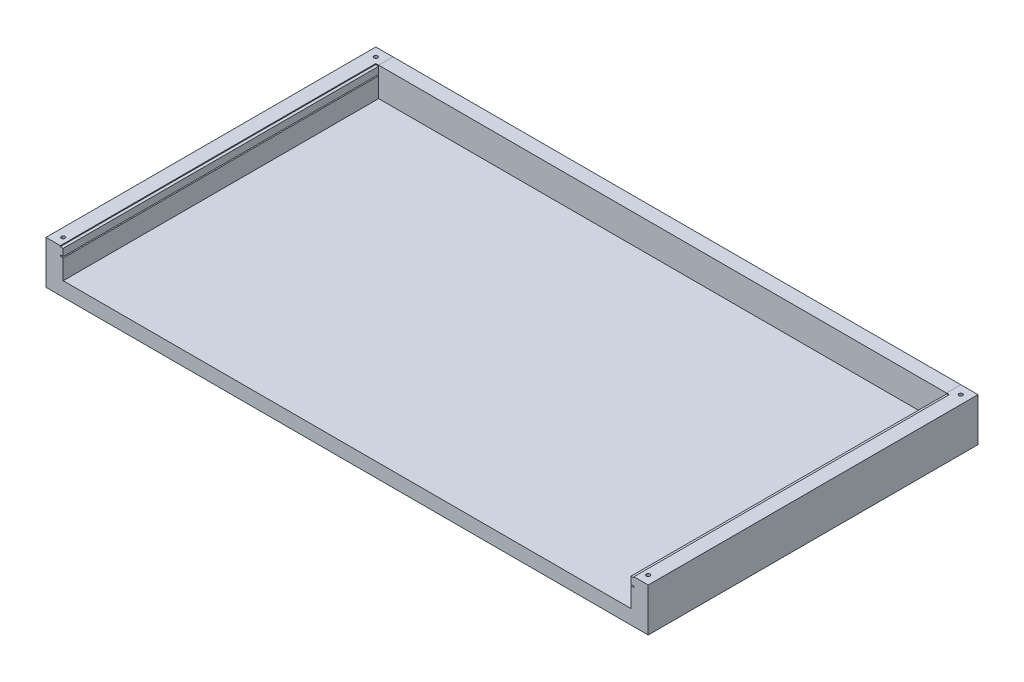
ISO-10303-21;
HEADER;
FILE_DESCRIPTION(('STEP AP214'),'2;1');
FILE_NAME('part.step','',(''),(''),'','','');
FILE_SCHEMA(('AUTOMOTIVE_DESIGN { 1 0 10303 214 1 1 1 1 }'));
ENDSEC;
DATA;
#1=APPLICATION_CONTEXT('core data for automotive mechanical design processes');
#2=APPLICATION_PROTOCOL_DEFINITION('international standard','automotive_design',2000,#1);
#3=PRODUCT_CONTEXT('',#1,'mechanical');
#4=PRODUCT('Part','Part','',(#3));
#5=PRODUCT_RELATED_PRODUCT_CATEGORY('part','',(#4));
#6=PRODUCT_DEFINITION_FORMATION('','',#4);
#7=PRODUCT_DEFINITION_CONTEXT('part definition',#1,'design');
#8=PRODUCT_DEFINITION('design','',#6,#7);
#9=PRODUCT_DEFINITION_SHAPE('','',#8);
#10=(LENGTH_UNIT() NAMED_UNIT(*) SI_UNIT(.MILLI.,.METRE.));
#11=(NAMED_UNIT(*) PLANE_ANGLE_UNIT() SI_UNIT($,.RADIAN.));
#12=(NAMED_UNIT(*) SI_UNIT($,.STERADIAN.) SOLID_ANGLE_UNIT());
#13=UNCERTAINTY_MEASURE_WITH_UNIT(LENGTH_MEASURE(1.E-05),#10,'distance_accuracy_value','');
#14=(GEOMETRIC_REPRESENTATION_CONTEXT(3) GLOBAL_UNCERTAINTY_ASSIGNED_CONTEXT((#13)) GLOBAL_UNIT_ASSIGNED_CONTEXT((#10,
#11,#12)) REPRESENTATION_CONTEXT('',''));
#15=CARTESIAN_POINT('',(0.,0.,0.));
#16=DIRECTION('',(0.,0.,1.));
#17=DIRECTION('',(1.,0.,0.));
#18=AXIS2_PLACEMENT_3D('',#15,#16,#17);
#19=CARTESIAN_POINT('',(0.,0.,0.));
#20=DIRECTION('',(0.,1.,0.));
#21=DIRECTION('',(0.,0.,1.));
#22=AXIS2_PLACEMENT_3D('',#19,#20,#21);
#23=PLANE('',#22);
#24=DIRECTION('',(-1.,0.,0.));
#25=VECTOR('',#24,1.);
#26=CARTESIAN_POINT('',(990.,0.,0.));
#27=LINE('',#26,#25);
#28=CARTESIAN_POINT('',(990.,0.,0.));
#29=VERTEX_POINT('',#28);
#30=CARTESIAN_POINT('',(-990.,0.,0.));
#31=VERTEX_POINT('',#30);
#32=EDGE_CURVE('E98',#29,#31,#27,.T.);
#33=ORIENTED_EDGE('',*,*,#32,.F.);
#34=DIRECTION('',(0.,0.,-1.));
#35=VECTOR('',#34,1.);
#36=CARTESIAN_POINT('',(990.,0.,50.0000000000005));
#37=LINE('',#36,#35);
#38=CARTESIAN_POINT('',(990.,0.,50.0000000000005));
#39=VERTEX_POINT('',#38);
#40=EDGE_CURVE('E109',#39,#29,#37,.T.);
#41=ORIENTED_EDGE('',*,*,#40,.F.);
#42=DIRECTION('',(1.,0.,0.));
#43=VECTOR('',#42,1.);
#44=CARTESIAN_POINT('',(-990.,0.,50.0000000000005));
#45=LINE('',#44,#43);
#46=CARTESIAN_POINT('',(-990.,0.,50.0000000000005));
#47=VERTEX_POINT('',#46);
#48=EDGE_CURVE('E100',#47,#39,#45,.T.);
#49=ORIENTED_EDGE('',*,*,#48,.F.);
#50=DIRECTION('',(0.,0.,1.));
#51=VECTOR('',#50,1.);
#52=CARTESIAN_POINT('',(-990.,0.,0.));
#53=LINE('',#52,#51);
#54=EDGE_CURVE('E90',#31,#47,#53,.T.);
#55=ORIENTED_EDGE('',*,*,#54,.F.);
#56=EDGE_LOOP('',(#33,#41,#49,#55));
#57=FACE_BOUND('',#56,.T.);
#58=ADVANCED_FACE('F48',(#57),#23,.F.);
#59=CARTESIAN_POINT('',(990.,2131.68121251787,50.0000000000005));
#60=DIRECTION('',(-1.,0.,0.));
#61=DIRECTION('',(0.,0.,1.));
#62=AXIS2_PLACEMENT_3D('',#59,#60,#61);
#63=PLANE('',#62);
#64=DIRECTION('',(0.,-1.,0.));
#65=VECTOR('',#64,1.);
#66=CARTESIAN_POINT('',(990.,2131.68121251787,0.));
#67=LINE('',#66,#65);
#68=CARTESIAN_POINT('',(990.,151.05,0.));
#69=VERTEX_POINT('',#68);
#70=EDGE_CURVE('E103',#69,#29,#67,.T.);
#71=ORIENTED_EDGE('',*,*,#70,.F.);
#72=DIRECTION('',(0.,0.,1.));
#73=VECTOR('',#72,1.);
#74=CARTESIAN_POINT('',(990.,151.05,50.0000000000005));
#75=LINE('',#74,#73);
#76=CARTESIAN_POINT('',(990.,151.05,50.0000000000005));
#77=VERTEX_POINT('',#76);
#78=EDGE_CURVE('E52',#69,#77,#75,.T.);
#79=ORIENTED_EDGE('',*,*,#78,.T.);
#80=DIRECTION('',(0.,-1.,0.));
#81=VECTOR('',#80,1.);
#82=CARTESIAN_POINT('',(990.,2131.68121251787,50.0000000000005));
#83=LINE('',#82,#81);
#84=EDGE_CURVE('E112',#77,#39,#83,.T.);
#85=ORIENTED_EDGE('',*,*,#84,.T.);
#86=ORIENTED_EDGE('',*,*,#40,.T.);
#87=EDGE_LOOP('',(#71,#79,#85,#86));
#88=FACE_BOUND('',#87,.T.);
#89=ADVANCED_FACE('F121',(#88),#63,.F.);
#90=CARTESIAN_POINT('',(-990.,2131.68121251787,50.0000000000005));
#91=DIRECTION('',(0.,0.,-1.));
#92=DIRECTION('',(-1.,0.,0.));
#93=AXIS2_PLACEMENT_3D('',#90,#91,#92);
#94=PLANE('',#93);
#95=ORIENTED_EDGE('',*,*,#84,.F.);
#96=DIRECTION('',(-1.,0.,0.));
#97=VECTOR('',#96,1.);
#98=CARTESIAN_POINT('',(-990.,151.05,50.0000000000005));
#99=LINE('',#98,#97);
#100=CARTESIAN_POINT('',(-990.,151.05,50.0000000000005));
#101=VERTEX_POINT('',#100);
#102=EDGE_CURVE('E118',#77,#101,#99,.T.);
#103=ORIENTED_EDGE('',*,*,#102,.T.);
#104=DIRECTION('',(0.,-1.,0.));
#105=VECTOR('',#104,1.);
#106=CARTESIAN_POINT('',(-990.,2131.68121251787,50.0000000000005));
#107=LINE('',#106,#105);
#108=EDGE_CURVE('E94',#101,#47,#107,.T.);
#109=ORIENTED_EDGE('',*,*,#108,.T.);
#110=ORIENTED_EDGE('',*,*,#48,.T.);
#111=EDGE_LOOP('',(#95,#103,#109,#110));
#112=FACE_BOUND('',#111,.T.);
#113=ADVANCED_FACE('F117',(#112),#94,.F.);
#114=CARTESIAN_POINT('',(-990.,2131.68121251787,0.));
#115=DIRECTION('',(1.,0.,0.));
#116=DIRECTION('',(0.,0.,-1.));
#117=AXIS2_PLACEMENT_3D('',#114,#115,#116);
#118=PLANE('',#117);
#119=ORIENTED_EDGE('',*,*,#108,.F.);
#120=DIRECTION('',(0.,0.,-1.));
#121=VECTOR('',#120,1.);
#122=CARTESIAN_POINT('',(-990.,151.05,0.));
#123=LINE('',#122,#121);
#124=CARTESIAN_POINT('',(-990.,151.05,0.));
#125=VERTEX_POINT('',#124);
#126=EDGE_CURVE('E57',#101,#125,#123,.T.);
#127=ORIENTED_EDGE('',*,*,#126,.T.);
#128=DIRECTION('',(0.,-1.,0.));
#129=VECTOR('',#128,1.);
#130=CARTESIAN_POINT('',(-990.,2131.68121251787,0.));
#131=LINE('',#130,#129);
#132=EDGE_CURVE('E87',#125,#31,#131,.T.);
#133=ORIENTED_EDGE('',*,*,#132,.T.);
#134=ORIENTED_EDGE('',*,*,#54,.T.);
#135=EDGE_LOOP('',(#119,#127,#133,#134));
#136=FACE_BOUND('',#135,.T.);
#137=ADVANCED_FACE('F89',(#136),#118,.F.);
#138=CARTESIAN_POINT('',(990.,2131.68121251787,0.));
#139=DIRECTION('',(0.,0.,1.));
#140=DIRECTION('',(1.,0.,0.));
#141=AXIS2_PLACEMENT_3D('',#138,#139,#140);
#142=PLANE('',#141);
#143=ORIENTED_EDGE('',*,*,#132,.F.);
#144=DIRECTION('',(1.,0.,0.));
#145=VECTOR('',#144,1.);
#146=CARTESIAN_POINT('',(990.,151.05,0.));
#147=LINE('',#146,#145);
#148=EDGE_CURVE('E12',#125,#69,#147,.T.);
#149=ORIENTED_EDGE('',*,*,#148,.T.);
#150=ORIENTED_EDGE('',*,*,#70,.T.);
#151=ORIENTED_EDGE('',*,*,#32,.T.);
#152=EDGE_LOOP('',(#143,#149,#150,#151));
#153=FACE_BOUND('',#152,.T.);
#154=ADVANCED_FACE('F50',(#153),#142,.F.);
#155=CARTESIAN_POINT('',(-1050.,151.05,1150.));
#156=DIRECTION('',(0.,-1.,0.));
#157=DIRECTION('',(0.,0.,-1.));
#158=AXIS2_PLACEMENT_3D('',#155,#156,#157);
#159=PLANE('',#158);
#160=ORIENTED_EDGE('',*,*,#126,.F.);
#161=ORIENTED_EDGE('',*,*,#102,.F.);
#162=ORIENTED_EDGE('',*,*,#78,.F.);
#163=ORIENTED_EDGE('',*,*,#148,.F.);
#164=EDGE_LOOP('',(#160,#161,#162,#163));
#165=FACE_BOUND('',#164,.T.);
#166=ADVANCED_FACE('F135',(#165),#159,.F.);
#167=CLOSED_SHELL('',(#58,#89,#113,#137,#154,#166));
#168=MANIFOLD_SOLID_BREP('B2',#167);
#169=CARTESIAN_POINT('',(1050.,151.05,1150.));
#170=DIRECTION('',(0.,-1.,0.));
#171=DIRECTION('',(0.,0.,-1.));
#172=AXIS2_PLACEMENT_3D('',#169,#170,#171);
#173=PLANE('',#172);
#174=CARTESIAN_POINT('',(1020.,151.05,1120.));
#175=DIRECTION('',(0.,-1.,0.));
#176=DIRECTION('',(0.,0.,-1.));
#177=AXIS2_PLACEMENT_3D('',#174,#175,#176);
#178=CIRCLE('',#177,6.35000000000015);
#179=CARTESIAN_POINT('',(1020.,151.05,1113.65));
#180=VERTEX_POINT('',#179);
#181=EDGE_CURVE('E572',#180,#180,#178,.T.);
#182=ORIENTED_EDGE('',*,*,#181,.T.);
#183=EDGE_LOOP('',(#182));
#184=FACE_BOUND('',#183,.T.);
#185=CARTESIAN_POINT('',(1020.,151.05,30.));
#186=DIRECTION('',(0.,-1.,0.));
#187=DIRECTION('',(0.,0.,-1.));
#188=AXIS2_PLACEMENT_3D('',#185,#186,#187);
#189=CIRCLE('',#188,6.35000000000016);
#190=CARTESIAN_POINT('',(1020.,151.05,23.6499999999999));
#191=VERTEX_POINT('',#190);
#192=EDGE_CURVE('E564',#191,#191,#189,.T.);
#193=ORIENTED_EDGE('',*,*,#192,.T.);
#194=EDGE_LOOP('',(#193));
#195=FACE_BOUND('',#194,.T.);
#196=DIRECTION('',(0.,0.,1.));
#197=VECTOR('',#196,1.);
#198=CARTESIAN_POINT('',(1000.,151.05,-1950.00440999514));
#199=LINE('',#198,#197);
#200=CARTESIAN_POINT('',(1000.,151.05,50.0000000000007));
#201=VERTEX_POINT('',#200);
#202=CARTESIAN_POINT('',(1000.,151.05,1150.));
#203=VERTEX_POINT('',#202);
#204=EDGE_CURVE('E321',#201,#203,#199,.T.);
#205=ORIENTED_EDGE('',*,*,#204,.T.);
#206=DIRECTION('',(-1.,0.,0.));
#207=VECTOR('',#206,1.);
#208=CARTESIAN_POINT('',(1050.,151.05,1150.));
#209=LINE('',#208,#207);
#210=CARTESIAN_POINT('',(1050.,151.05,1150.));
#211=VERTEX_POINT('',#210);
#212=EDGE_CURVE('E448',#211,#203,#209,.T.);
#213=ORIENTED_EDGE('',*,*,#212,.F.);
#214=DIRECTION('',(0.,0.,-1.));
#215=VECTOR('',#214,1.);
#216=CARTESIAN_POINT('',(1050.,151.05,1150.));
#217=LINE('',#216,#215);
#218=CARTESIAN_POINT('',(1050.,151.05,0.));
#219=VERTEX_POINT('',#218);
#220=EDGE_CURVE('E522',#211,#219,#217,.T.);
#221=ORIENTED_EDGE('',*,*,#220,.T.);
#222=DIRECTION('',(-1.,0.,0.));
#223=VECTOR('',#222,1.);
#224=CARTESIAN_POINT('',(1050.,151.05,0.));
#225=LINE('',#224,#223);
#226=CARTESIAN_POINT('',(990.,151.05,0.));
#227=VERTEX_POINT('',#226);
#228=EDGE_CURVE('E477',#219,#227,#225,.T.);
#229=ORIENTED_EDGE('',*,*,#228,.T.);
#230=DIRECTION('',(0.,0.,-1.));
#231=VECTOR('',#230,1.);
#232=CARTESIAN_POINT('',(990.,151.05,1150.));
#233=LINE('',#232,#231);
#234=CARTESIAN_POINT('',(990.,151.05,50.0000000000007));
#235=VERTEX_POINT('',#234);
#236=EDGE_CURVE('E345',#235,#227,#233,.T.);
#237=ORIENTED_EDGE('',*,*,#236,.F.);
#238=DIRECTION('',(1.,0.,0.));
#239=VECTOR('',#238,1.);
#240=CARTESIAN_POINT('',(0.,151.05,50.0000000000007));
#241=LINE('',#240,#239);
#242=EDGE_CURVE('E336',#235,#201,#241,.T.);
#243=ORIENTED_EDGE('',*,*,#242,.T.);
#244=EDGE_LOOP('',(#205,#213,#221,#229,#237,#243));
#245=FACE_BOUND('',#244,.T.);
#246=ADVANCED_FACE('F171',(#184,#195,#245),#173,.F.);
#247=CARTESIAN_POINT('',(990.,151.05,1150.));
#248=DIRECTION('',(1.,0.,0.));
#249=DIRECTION('',(0.,0.,-1.));
#250=AXIS2_PLACEMENT_3D('',#247,#248,#249);
#251=PLANE('',#250);
#252=DIRECTION('',(0.,0.,1.));
#253=VECTOR('',#252,1.);
#254=CARTESIAN_POINT('',(990.,147.85,1150.));
#255=LINE('',#254,#253);
#256=CARTESIAN_POINT('',(990.,147.85,50.0000000000007));
#257=VERTEX_POINT('',#256);
#258=CARTESIAN_POINT('',(990.,147.85,1150.));
#259=VERTEX_POINT('',#258);
#260=EDGE_CURVE('E429',#257,#259,#255,.T.);
#261=ORIENTED_EDGE('',*,*,#260,.F.);
#262=DIRECTION('',(0.,1.,0.));
#263=VECTOR('',#262,1.);
#264=CARTESIAN_POINT('',(990.,151.05,50.0000000000005));
#265=LINE('',#264,#263);
#266=EDGE_CURVE('E436',#257,#235,#265,.T.);
#267=ORIENTED_EDGE('',*,*,#266,.T.);
#268=ORIENTED_EDGE('',*,*,#236,.T.);
#269=DIRECTION('',(0.,-1.,0.));
#270=VECTOR('',#269,1.);
#271=CARTESIAN_POINT('',(990.,151.05,0.));
#272=LINE('',#271,#270);
#273=CARTESIAN_POINT('',(990.,50.,0.));
#274=VERTEX_POINT('',#273);
#275=EDGE_CURVE('E480',#227,#274,#272,.T.);
#276=ORIENTED_EDGE('',*,*,#275,.T.);
#277=DIRECTION('',(0.,0.,-1.));
#278=VECTOR('',#277,1.);
#279=CARTESIAN_POINT('',(990.,50.,1150.));
#280=LINE('',#279,#278);
#281=CARTESIAN_POINT('',(990.,50.,1150.));
#282=VERTEX_POINT('',#281);
#283=EDGE_CURVE('E516',#282,#274,#280,.T.);
#284=ORIENTED_EDGE('',*,*,#283,.F.);
#285=DIRECTION('',(0.,-1.,0.));
#286=VECTOR('',#285,1.);
#287=CARTESIAN_POINT('',(990.,151.05,1150.));
#288=LINE('',#287,#286);
#289=CARTESIAN_POINT('',(990.,118.85,1150.));
#290=VERTEX_POINT('',#289);
#291=EDGE_CURVE('E452',#290,#282,#288,.T.);
#292=ORIENTED_EDGE('',*,*,#291,.F.);
#293=DIRECTION('',(0.,0.,1.));
#294=VECTOR('',#293,1.);
#295=CARTESIAN_POINT('',(990.,118.85,1150.));
#296=LINE('',#295,#294);
#297=CARTESIAN_POINT('',(990.,118.85,50.0000000000007));
#298=VERTEX_POINT('',#297);
#299=EDGE_CURVE('E423',#298,#290,#296,.T.);
#300=ORIENTED_EDGE('',*,*,#299,.F.);
#301=DIRECTION('',(0.,1.,0.));
#302=VECTOR('',#301,1.);
#303=CARTESIAN_POINT('',(990.,151.05,50.0000000000005));
#304=LINE('',#303,#302);
#305=CARTESIAN_POINT('',(990.,123.05,50.0000000000007));
#306=VERTEX_POINT('',#305);
#307=EDGE_CURVE('E439',#298,#306,#304,.T.);
#308=ORIENTED_EDGE('',*,*,#307,.T.);
#309=DIRECTION('',(0.,0.,-1.));
#310=VECTOR('',#309,1.);
#311=CARTESIAN_POINT('',(990.,123.05,1150.));
#312=LINE('',#311,#310);
#313=CARTESIAN_POINT('',(990.,123.05,1150.));
#314=VERTEX_POINT('',#313);
#315=EDGE_CURVE('E417',#314,#306,#312,.T.);
#316=ORIENTED_EDGE('',*,*,#315,.F.);
#317=EDGE_CURVE('E455',#259,#314,#288,.T.);
#318=ORIENTED_EDGE('',*,*,#317,.F.);
#319=EDGE_LOOP('',(#261,#267,#268,#276,#284,#292,#300,#308,#316,#318));
#320=FACE_BOUND('',#319,.T.);
#321=ADVANCED_FACE('F634',(#320),#251,.F.);
#322=CARTESIAN_POINT('',(-990.,151.05,1150.));
#323=DIRECTION('',(-1.,0.,0.));
#324=DIRECTION('',(0.,0.,1.));
#325=AXIS2_PLACEMENT_3D('',#322,#323,#324);
#326=PLANE('',#325);
#327=DIRECTION('',(0.,0.,-1.));
#328=VECTOR('',#327,1.);
#329=CARTESIAN_POINT('',(-990.,147.85,1150.));
#330=LINE('',#329,#328);
#331=CARTESIAN_POINT('',(-990.,147.85,1150.));
#332=VERTEX_POINT('',#331);
#333=CARTESIAN_POINT('',(-990.,147.85,50.0000000000007));
#334=VERTEX_POINT('',#333);
#335=EDGE_CURVE('E426',#332,#334,#330,.T.);
#336=ORIENTED_EDGE('',*,*,#335,.F.);
#337=DIRECTION('',(0.,1.,0.));
#338=VECTOR('',#337,1.);
#339=CARTESIAN_POINT('',(-990.,151.05,1150.));
#340=LINE('',#339,#338);
#341=CARTESIAN_POINT('',(-990.,123.05,1150.));
#342=VERTEX_POINT('',#341);
#343=EDGE_CURVE('E459',#342,#332,#340,.T.);
#344=ORIENTED_EDGE('',*,*,#343,.F.);
#345=DIRECTION('',(0.,0.,1.));
#346=VECTOR('',#345,1.);
#347=CARTESIAN_POINT('',(-990.,123.05,1150.));
#348=LINE('',#347,#346);
#349=CARTESIAN_POINT('',(-990.,123.05,50.0000000000007));
#350=VERTEX_POINT('',#349);
#351=EDGE_CURVE('E353',#350,#342,#348,.T.);
#352=ORIENTED_EDGE('',*,*,#351,.F.);
#353=DIRECTION('',(0.,-1.,0.));
#354=VECTOR('',#353,1.);
#355=CARTESIAN_POINT('',(-990.,151.05,50.0000000000005));
#356=LINE('',#355,#354);
#357=CARTESIAN_POINT('',(-990.,118.849999999999,50.0000000000007));
#358=VERTEX_POINT('',#357);
#359=EDGE_CURVE('E46',#350,#358,#356,.T.);
#360=ORIENTED_EDGE('',*,*,#359,.T.);
#361=DIRECTION('',(0.,0.,-1.));
#362=VECTOR('',#361,1.);
#363=CARTESIAN_POINT('',(-990.,118.849999999999,1150.));
#364=LINE('',#363,#362);
#365=CARTESIAN_POINT('',(-990.,118.849999999999,1150.));
#366=VERTEX_POINT('',#365);
#367=EDGE_CURVE('E420',#366,#358,#364,.T.);
#368=ORIENTED_EDGE('',*,*,#367,.F.);
#369=CARTESIAN_POINT('',(-990.,50.,1150.));
#370=VERTEX_POINT('',#369);
#371=EDGE_CURVE('E460',#370,#366,#340,.T.);
#372=ORIENTED_EDGE('',*,*,#371,.F.);
#373=DIRECTION('',(0.,0.,-1.));
#374=VECTOR('',#373,1.);
#375=CARTESIAN_POINT('',(-990.,50.,1150.));
#376=LINE('',#375,#374);
#377=CARTESIAN_POINT('',(-990.,50.,0.));
#378=VERTEX_POINT('',#377);
#379=EDGE_CURVE('E512',#370,#378,#376,.T.);
#380=ORIENTED_EDGE('',*,*,#379,.T.);
#381=DIRECTION('',(0.,1.,0.));
#382=VECTOR('',#381,1.);
#383=CARTESIAN_POINT('',(-990.,151.05,0.));
#384=LINE('',#383,#382);
#385=CARTESIAN_POINT('',(-990.,151.05,0.));
#386=VERTEX_POINT('',#385);
#387=EDGE_CURVE('E486',#378,#386,#384,.T.);
#388=ORIENTED_EDGE('',*,*,#387,.T.);
#389=DIRECTION('',(0.,0.,-1.));
#390=VECTOR('',#389,1.);
#391=CARTESIAN_POINT('',(-990.,151.05,1150.));
#392=LINE('',#391,#390);
#393=CARTESIAN_POINT('',(-990.,151.05,50.0000000000007));
#394=VERTEX_POINT('',#393);
#395=EDGE_CURVE('E509',#394,#386,#392,.T.);
#396=ORIENTED_EDGE('',*,*,#395,.F.);
#397=DIRECTION('',(0.,-1.,0.));
#398=VECTOR('',#397,1.);
#399=CARTESIAN_POINT('',(-990.,151.05,50.0000000000005));
#400=LINE('',#399,#398);
#401=EDGE_CURVE('E432',#394,#334,#400,.T.);
#402=ORIENTED_EDGE('',*,*,#401,.T.);
#403=EDGE_LOOP('',(#336,#344,#352,#360,#368,#372,#380,#388,#396,#402));
#404=FACE_BOUND('',#403,.T.);
#405=ADVANCED_FACE('F548',(#404),#326,.F.);
#406=CARTESIAN_POINT('',(-1050.,151.05,1150.));
#407=DIRECTION('',(0.,-1.,0.));
#408=DIRECTION('',(0.,0.,-1.));
#409=AXIS2_PLACEMENT_3D('',#406,#407,#408);
#410=PLANE('',#409);
#411=CARTESIAN_POINT('',(-1020.,151.05,1120.));
#412=DIRECTION('',(0.,-1.,0.));
#413=DIRECTION('',(0.,0.,-1.));
#414=AXIS2_PLACEMENT_3D('',#411,#412,#413);
#415=CIRCLE('',#414,6.35000000000015);
#416=CARTESIAN_POINT('',(-1020.,151.05,1113.65));
#417=VERTEX_POINT('',#416);
#418=EDGE_CURVE('E580',#417,#417,#415,.T.);
#419=ORIENTED_EDGE('',*,*,#418,.T.);
#420=EDGE_LOOP('',(#419));
#421=FACE_BOUND('',#420,.T.);
#422=CARTESIAN_POINT('',(-1020.,151.05,30.));
#423=DIRECTION('',(0.,-1.,0.));
#424=DIRECTION('',(0.,0.,-1.));
#425=AXIS2_PLACEMENT_3D('',#422,#423,#424);
#426=CIRCLE('',#425,6.35000000000016);
#427=CARTESIAN_POINT('',(-1020.,151.05,23.6499999999999));
#428=VERTEX_POINT('',#427);
#429=EDGE_CURVE('E588',#428,#428,#426,.T.);
#430=ORIENTED_EDGE('',*,*,#429,.T.);
#431=EDGE_LOOP('',(#430));
#432=FACE_BOUND('',#431,.T.);
#433=DIRECTION('',(0.,0.,1.));
#434=VECTOR('',#433,1.);
#435=CARTESIAN_POINT('',(-1000.,151.05,-1950.00440999514));
#436=LINE('',#435,#434);
#437=CARTESIAN_POINT('',(-1000.,151.05,50.0000000000007));
#438=VERTEX_POINT('',#437);
#439=CARTESIAN_POINT('',(-1000.,151.05,1150.));
#440=VERTEX_POINT('',#439);
#441=EDGE_CURVE('E331',#438,#440,#436,.T.);
#442=ORIENTED_EDGE('',*,*,#441,.F.);
#443=EDGE_CURVE('E347',#438,#394,#241,.T.);
#444=ORIENTED_EDGE('',*,*,#443,.T.);
#445=ORIENTED_EDGE('',*,*,#395,.T.);
#446=DIRECTION('',(-1.,0.,0.));
#447=VECTOR('',#446,1.);
#448=CARTESIAN_POINT('',(-1050.,151.05,0.));
#449=LINE('',#448,#447);
#450=CARTESIAN_POINT('',(-1050.,151.05,0.));
#451=VERTEX_POINT('',#450);
#452=EDGE_CURVE('E490',#386,#451,#449,.T.);
#453=ORIENTED_EDGE('',*,*,#452,.T.);
#454=DIRECTION('',(0.,0.,-1.));
#455=VECTOR('',#454,1.);
#456=CARTESIAN_POINT('',(-1050.,151.05,1150.));
#457=LINE('',#456,#455);
#458=CARTESIAN_POINT('',(-1050.,151.05,1150.));
#459=VERTEX_POINT('',#458);
#460=EDGE_CURVE('E505',#459,#451,#457,.T.);
#461=ORIENTED_EDGE('',*,*,#460,.F.);
#462=DIRECTION('',(-1.,0.,0.));
#463=VECTOR('',#462,1.);
#464=CARTESIAN_POINT('',(-1050.,151.05,1150.));
#465=LINE('',#464,#463);
#466=EDGE_CURVE('E464',#440,#459,#465,.T.);
#467=ORIENTED_EDGE('',*,*,#466,.F.);
#468=EDGE_LOOP('',(#442,#444,#445,#453,#461,#467));
#469=FACE_BOUND('',#468,.T.);
#470=ADVANCED_FACE('F556',(#421,#432,#469),#410,.F.);
#471=CARTESIAN_POINT('',(0.,0.,1150.));
#472=DIRECTION('',(0.,0.,1.));
#473=DIRECTION('',(1.,0.,0.));
#474=AXIS2_PLACEMENT_3D('',#471,#472,#473);
#475=PLANE('',#474);
#476=ORIENTED_EDGE('',*,*,#343,.T.);
#477=DIRECTION('',(-1.,0.,0.));
#478=VECTOR('',#477,1.);
#479=CARTESIAN_POINT('',(0.,147.85,1150.));
#480=LINE('',#479,#478);
#481=CARTESIAN_POINT('',(-1000.,147.85,1150.));
#482=VERTEX_POINT('',#481);
#483=EDGE_CURVE('E180',#332,#482,#480,.T.);
#484=ORIENTED_EDGE('',*,*,#483,.T.);
#485=DIRECTION('',(0.,1.,0.));
#486=VECTOR('',#485,1.);
#487=CARTESIAN_POINT('',(-1000.,0.,1150.));
#488=LINE('',#487,#486);
#489=EDGE_CURVE('E364',#482,#440,#488,.T.);
#490=ORIENTED_EDGE('',*,*,#489,.T.);
#491=ORIENTED_EDGE('',*,*,#466,.T.);
#492=DIRECTION('',(0.,-1.,0.));
#493=VECTOR('',#492,1.);
#494=CARTESIAN_POINT('',(-1050.,151.05,1150.));
#495=LINE('',#494,#493);
#496=CARTESIAN_POINT('',(-1050.,0.,1150.));
#497=VERTEX_POINT('',#496);
#498=EDGE_CURVE('E467',#459,#497,#495,.T.);
#499=ORIENTED_EDGE('',*,*,#498,.T.);
#500=DIRECTION('',(1.,0.,0.));
#501=VECTOR('',#500,1.);
#502=CARTESIAN_POINT('',(-1050.,0.,1150.));
#503=LINE('',#502,#501);
#504=CARTESIAN_POINT('',(1050.,0.,1150.));
#505=VERTEX_POINT('',#504);
#506=EDGE_CURVE('E470',#497,#505,#503,.T.);
#507=ORIENTED_EDGE('',*,*,#506,.T.);
#508=DIRECTION('',(0.,1.,0.));
#509=VECTOR('',#508,1.);
#510=CARTESIAN_POINT('',(1050.,151.05,1150.));
#511=LINE('',#510,#509);
#512=EDGE_CURVE('E444',#505,#211,#511,.T.);
#513=ORIENTED_EDGE('',*,*,#512,.T.);
#514=ORIENTED_EDGE('',*,*,#212,.T.);
#515=DIRECTION('',(0.,-1.,0.));
#516=VECTOR('',#515,1.);
#517=CARTESIAN_POINT('',(1000.,0.,1150.));
#518=LINE('',#517,#516);
#519=CARTESIAN_POINT('',(1000.,147.85,1150.));
#520=VERTEX_POINT('',#519);
#521=EDGE_CURVE('E326',#203,#520,#518,.T.);
#522=ORIENTED_EDGE('',*,*,#521,.T.);
#523=DIRECTION('',(-1.,0.,0.));
#524=VECTOR('',#523,1.);
#525=CARTESIAN_POINT('',(0.,147.85,1150.));
#526=LINE('',#525,#524);
#527=EDGE_CURVE('E187',#520,#259,#526,.T.);
#528=ORIENTED_EDGE('',*,*,#527,.T.);
#529=ORIENTED_EDGE('',*,*,#317,.T.);
#530=DIRECTION('',(1.,0.,0.));
#531=VECTOR('',#530,1.);
#532=CARTESIAN_POINT('',(0.,123.05,1150.));
#533=LINE('',#532,#531);
#534=CARTESIAN_POINT('',(1000.,123.05,1150.));
#535=VERTEX_POINT('',#534);
#536=EDGE_CURVE('E526',#314,#535,#533,.T.);
#537=ORIENTED_EDGE('',*,*,#536,.T.);
#538=DIRECTION('',(0.,-1.,0.));
#539=VECTOR('',#538,1.);
#540=CARTESIAN_POINT('',(1000.,0.,1150.));
#541=LINE('',#540,#539);
#542=CARTESIAN_POINT('',(1000.,118.85,1150.));
#543=VERTEX_POINT('',#542);
#544=EDGE_CURVE('E371',#535,#543,#541,.T.);
#545=ORIENTED_EDGE('',*,*,#544,.T.);
#546=DIRECTION('',(-1.,0.,0.));
#547=VECTOR('',#546,1.);
#548=CARTESIAN_POINT('',(0.,118.85,1150.));
#549=LINE('',#548,#547);
#550=EDGE_CURVE('E195',#543,#290,#549,.T.);
#551=ORIENTED_EDGE('',*,*,#550,.T.);
#552=ORIENTED_EDGE('',*,*,#291,.T.);
#553=DIRECTION('',(-1.,0.,0.));
#554=VECTOR('',#553,1.);
#555=CARTESIAN_POINT('',(-990.,50.,1150.));
#556=LINE('',#555,#554);
#557=EDGE_CURVE('E456',#282,#370,#556,.T.);
#558=ORIENTED_EDGE('',*,*,#557,.T.);
#559=ORIENTED_EDGE('',*,*,#371,.T.);
#560=DIRECTION('',(-1.,0.,0.));
#561=VECTOR('',#560,1.);
#562=CARTESIAN_POINT('',(0.,118.85,1150.));
#563=LINE('',#562,#561);
#564=CARTESIAN_POINT('',(-1000.,118.849999999999,1150.));
#565=VERTEX_POINT('',#564);
#566=EDGE_CURVE('E530',#366,#565,#563,.T.);
#567=ORIENTED_EDGE('',*,*,#566,.T.);
#568=DIRECTION('',(0.,1.,0.));
#569=VECTOR('',#568,1.);
#570=CARTESIAN_POINT('',(-1000.,0.,1150.));
#571=LINE('',#570,#569);
#572=CARTESIAN_POINT('',(-1000.,123.05,1150.));
#573=VERTEX_POINT('',#572);
#574=EDGE_CURVE('E382',#565,#573,#571,.T.);
#575=ORIENTED_EDGE('',*,*,#574,.T.);
#576=DIRECTION('',(1.,0.,0.));
#577=VECTOR('',#576,1.);
#578=CARTESIAN_POINT('',(0.,123.05,1150.));
#579=LINE('',#578,#577);
#580=EDGE_CURVE('E377',#573,#342,#579,.T.);
#581=ORIENTED_EDGE('',*,*,#580,.T.);
#582=EDGE_LOOP('',(#476,#484,#490,#491,#499,#507,#513,#514,#522,#528,#529,#537,#545,#551,#552,
#558,#559,#567,#575,#581));
#583=FACE_BOUND('',#582,.T.);
#584=ADVANCED_FACE('F538',(#583),#475,.T.);
#585=CARTESIAN_POINT('',(1050.,151.05,1150.));
#586=DIRECTION('',(-1.,0.,0.));
#587=DIRECTION('',(0.,0.,1.));
#588=AXIS2_PLACEMENT_3D('',#585,#586,#587);
#589=PLANE('',#588);
#590=DIRECTION('',(0.,1.,0.));
#591=VECTOR('',#590,1.);
#592=CARTESIAN_POINT('',(1050.,151.05,0.));
#593=LINE('',#592,#591);
#594=CARTESIAN_POINT('',(1050.,0.,0.));
#595=VERTEX_POINT('',#594);
#596=EDGE_CURVE('E443',#595,#219,#593,.T.);
#597=ORIENTED_EDGE('',*,*,#596,.T.);
#598=ORIENTED_EDGE('',*,*,#220,.F.);
#599=ORIENTED_EDGE('',*,*,#512,.F.);
#600=DIRECTION('',(0.,0.,-1.));
#601=VECTOR('',#600,1.);
#602=CARTESIAN_POINT('',(1050.,0.,1150.));
#603=LINE('',#602,#601);
#604=EDGE_CURVE('E473',#505,#595,#603,.T.);
#605=ORIENTED_EDGE('',*,*,#604,.T.);
#606=EDGE_LOOP('',(#597,#598,#599,#605));
#607=FACE_BOUND('',#606,.T.);
#608=ADVANCED_FACE('F173',(#607),#589,.F.);
#609=CARTESIAN_POINT('',(-990.,50.,1150.));
#610=DIRECTION('',(0.,-1.,0.));
#611=DIRECTION('',(0.,0.,-1.));
#612=AXIS2_PLACEMENT_3D('',#609,#610,#611);
#613=PLANE('',#612);
#614=DIRECTION('',(-1.,0.,0.));
#615=VECTOR('',#614,1.);
#616=CARTESIAN_POINT('',(-990.,50.,0.));
#617=LINE('',#616,#615);
#618=EDGE_CURVE('E483',#274,#378,#617,.T.);
#619=ORIENTED_EDGE('',*,*,#618,.T.);
#620=ORIENTED_EDGE('',*,*,#379,.F.);
#621=ORIENTED_EDGE('',*,*,#557,.F.);
#622=ORIENTED_EDGE('',*,*,#283,.T.);
#623=EDGE_LOOP('',(#619,#620,#621,#622));
#624=FACE_BOUND('',#623,.T.);
#625=ADVANCED_FACE('F629',(#624),#613,.F.);
#626=CARTESIAN_POINT('',(-1050.,151.05,1150.));
#627=DIRECTION('',(1.,0.,0.));
#628=DIRECTION('',(0.,0.,-1.));
#629=AXIS2_PLACEMENT_3D('',#626,#627,#628);
#630=PLANE('',#629);
#631=DIRECTION('',(0.,-1.,0.));
#632=VECTOR('',#631,1.);
#633=CARTESIAN_POINT('',(-1050.,151.05,0.));
#634=LINE('',#633,#632);
#635=CARTESIAN_POINT('',(-1050.,0.,0.));
#636=VERTEX_POINT('',#635);
#637=EDGE_CURVE('E493',#451,#636,#634,.T.);
#638=ORIENTED_EDGE('',*,*,#637,.T.);
#639=DIRECTION('',(0.,0.,-1.));
#640=VECTOR('',#639,1.);
#641=CARTESIAN_POINT('',(-1050.,0.,1150.));
#642=LINE('',#641,#640);
#643=EDGE_CURVE('E501',#497,#636,#642,.T.);
#644=ORIENTED_EDGE('',*,*,#643,.F.);
#645=ORIENTED_EDGE('',*,*,#498,.F.);
#646=ORIENTED_EDGE('',*,*,#460,.T.);
#647=EDGE_LOOP('',(#638,#644,#645,#646));
#648=FACE_BOUND('',#647,.T.);
#649=ADVANCED_FACE('F603',(#648),#630,.F.);
#650=CARTESIAN_POINT('',(-1050.,0.,1150.));
#651=DIRECTION('',(0.,1.,0.));
#652=DIRECTION('',(0.,0.,1.));
#653=AXIS2_PLACEMENT_3D('',#650,#651,#652);
#654=PLANE('',#653);
#655=CARTESIAN_POINT('',(1020.,0.,1120.));
#656=DIRECTION('',(0.,-1.,0.));
#657=DIRECTION('',(0.,0.,-1.));
#658=AXIS2_PLACEMENT_3D('',#655,#656,#657);
#659=CIRCLE('',#658,6.35000000000015);
#660=CARTESIAN_POINT('',(1020.,0.,1113.65));
#661=VERTEX_POINT('',#660);
#662=EDGE_CURVE('E576',#661,#661,#659,.T.);
#663=ORIENTED_EDGE('',*,*,#662,.F.);
#664=EDGE_LOOP('',(#663));
#665=FACE_BOUND('',#664,.T.);
#666=CARTESIAN_POINT('',(-1020.,0.,1120.));
#667=DIRECTION('',(0.,-1.,0.));
#668=DIRECTION('',(0.,0.,-1.));
#669=AXIS2_PLACEMENT_3D('',#666,#667,#668);
#670=CIRCLE('',#669,6.35000000000015);
#671=CARTESIAN_POINT('',(-1020.,0.,1113.65));
#672=VERTEX_POINT('',#671);
#673=EDGE_CURVE('E584',#672,#672,#670,.T.);
#674=ORIENTED_EDGE('',*,*,#673,.F.);
#675=EDGE_LOOP('',(#674));
#676=FACE_BOUND('',#675,.T.);
#677=CARTESIAN_POINT('',(-1020.,0.,30.));
#678=DIRECTION('',(0.,-1.,0.));
#679=DIRECTION('',(0.,0.,-1.));
#680=AXIS2_PLACEMENT_3D('',#677,#678,#679);
#681=CIRCLE('',#680,6.35000000000016);
#682=CARTESIAN_POINT('',(-1020.,0.,23.6499999999999));
#683=VERTEX_POINT('',#682);
#684=EDGE_CURVE('E568',#683,#683,#681,.T.);
#685=ORIENTED_EDGE('',*,*,#684,.F.);
#686=EDGE_LOOP('',(#685));
#687=FACE_BOUND('',#686,.T.);
#688=CARTESIAN_POINT('',(1020.,0.,30.));
#689=DIRECTION('',(0.,-1.,0.));
#690=DIRECTION('',(0.,0.,-1.));
#691=AXIS2_PLACEMENT_3D('',#688,#689,#690);
#692=CIRCLE('',#691,6.35000000000016);
#693=CARTESIAN_POINT('',(1020.,0.,23.6499999999999));
#694=VERTEX_POINT('',#693);
#695=EDGE_CURVE('E414',#694,#694,#692,.T.);
#696=ORIENTED_EDGE('',*,*,#695,.F.);
#697=EDGE_LOOP('',(#696));
#698=FACE_BOUND('',#697,.T.);
#699=DIRECTION('',(1.,0.,0.));
#700=VECTOR('',#699,1.);
#701=CARTESIAN_POINT('',(-1050.,0.,0.));
#702=LINE('',#701,#700);
#703=EDGE_CURVE('E449',#636,#595,#702,.T.);
#704=ORIENTED_EDGE('',*,*,#703,.T.);
#705=ORIENTED_EDGE('',*,*,#604,.F.);
#706=ORIENTED_EDGE('',*,*,#506,.F.);
#707=ORIENTED_EDGE('',*,*,#643,.T.);
#708=EDGE_LOOP('',(#704,#705,#706,#707));
#709=FACE_BOUND('',#708,.T.);
#710=ADVANCED_FACE('F599',(#665,#676,#687,#698,#709),#654,.F.);
#711=CARTESIAN_POINT('',(0.,0.,0.));
#712=DIRECTION('',(0.,0.,1.));
#713=DIRECTION('',(1.,0.,0.));
#714=AXIS2_PLACEMENT_3D('',#711,#712,#713);
#715=PLANE('',#714);
#716=ORIENTED_EDGE('',*,*,#596,.F.);
#717=ORIENTED_EDGE('',*,*,#703,.F.);
#718=ORIENTED_EDGE('',*,*,#637,.F.);
#719=ORIENTED_EDGE('',*,*,#452,.F.);
#720=ORIENTED_EDGE('',*,*,#387,.F.);
#721=ORIENTED_EDGE('',*,*,#618,.F.);
#722=ORIENTED_EDGE('',*,*,#275,.F.);
#723=ORIENTED_EDGE('',*,*,#228,.F.);
#724=EDGE_LOOP('',(#716,#717,#718,#719,#720,#721,#722,#723));
#725=FACE_BOUND('',#724,.T.);
#726=ADVANCED_FACE('F602',(#725),#715,.F.);
#727=CARTESIAN_POINT('',(1000.,0.,-1950.00440999514));
#728=DIRECTION('',(-1.,0.,0.));
#729=DIRECTION('',(0.,0.,1.));
#730=AXIS2_PLACEMENT_3D('',#727,#728,#729);
#731=PLANE('',#730);
#732=DIRECTION('',(0.,-1.,0.));
#733=VECTOR('',#732,1.);
#734=CARTESIAN_POINT('',(1000.,0.,50.0000000000007));
#735=LINE('',#734,#733);
#736=CARTESIAN_POINT('',(1000.,123.05,50.0000000000007));
#737=VERTEX_POINT('',#736);
#738=CARTESIAN_POINT('',(1000.,118.85,50.0000000000007));
#739=VERTEX_POINT('',#738);
#740=EDGE_CURVE('E375',#737,#739,#735,.T.);
#741=ORIENTED_EDGE('',*,*,#740,.T.);
#742=DIRECTION('',(0.,0.,1.));
#743=VECTOR('',#742,1.);
#744=CARTESIAN_POINT('',(1000.,118.85,-1950.00440999514));
#745=LINE('',#744,#743);
#746=EDGE_CURVE('E389',#739,#543,#745,.T.);
#747=ORIENTED_EDGE('',*,*,#746,.T.);
#748=ORIENTED_EDGE('',*,*,#544,.F.);
#749=DIRECTION('',(0.,0.,1.));
#750=VECTOR('',#749,1.);
#751=CARTESIAN_POINT('',(1000.,123.05,-1950.00440999514));
#752=LINE('',#751,#750);
#753=EDGE_CURVE('E376',#737,#535,#752,.T.);
#754=ORIENTED_EDGE('',*,*,#753,.F.);
#755=EDGE_LOOP('',(#741,#747,#748,#754));
#756=FACE_BOUND('',#755,.T.);
#757=ADVANCED_FACE('F678',(#756),#731,.T.);
#758=CARTESIAN_POINT('',(0.,123.05,-1950.00440999514));
#759=DIRECTION('',(0.,-1.,0.));
#760=DIRECTION('',(0.,0.,-1.));
#761=AXIS2_PLACEMENT_3D('',#758,#759,#760);
#762=PLANE('',#761);
#763=ORIENTED_EDGE('',*,*,#315,.T.);
#764=DIRECTION('',(1.,0.,0.));
#765=VECTOR('',#764,1.);
#766=CARTESIAN_POINT('',(0.,123.05,50.0000000000007));
#767=LINE('',#766,#765);
#768=EDGE_CURVE('E393',#306,#737,#767,.T.);
#769=ORIENTED_EDGE('',*,*,#768,.T.);
#770=ORIENTED_EDGE('',*,*,#753,.T.);
#771=ORIENTED_EDGE('',*,*,#536,.F.);
#772=EDGE_LOOP('',(#763,#769,#770,#771));
#773=FACE_BOUND('',#772,.T.);
#774=ADVANCED_FACE('F645',(#773),#762,.T.);
#775=CARTESIAN_POINT('',(0.,118.85,-1950.00440999514));
#776=DIRECTION('',(0.,1.,0.));
#777=DIRECTION('',(-1.,0.,0.));
#778=AXIS2_PLACEMENT_3D('',#775,#776,#777);
#779=PLANE('',#778);
#780=ORIENTED_EDGE('',*,*,#299,.T.);
#781=ORIENTED_EDGE('',*,*,#550,.F.);
#782=ORIENTED_EDGE('',*,*,#746,.F.);
#783=DIRECTION('',(-1.,0.,0.));
#784=VECTOR('',#783,1.);
#785=CARTESIAN_POINT('',(0.,118.85,50.0000000000007));
#786=LINE('',#785,#784);
#787=EDGE_CURVE('E398',#739,#298,#786,.T.);
#788=ORIENTED_EDGE('',*,*,#787,.T.);
#789=EDGE_LOOP('',(#780,#781,#782,#788));
#790=FACE_BOUND('',#789,.T.);
#791=ADVANCED_FACE('F675',(#790),#779,.T.);
#792=CARTESIAN_POINT('',(-990.,2131.68121251787,50.0000000000005));
#793=DIRECTION('',(0.,0.,-1.));
#794=DIRECTION('',(-1.,0.,0.));
#795=AXIS2_PLACEMENT_3D('',#792,#793,#794);
#796=PLANE('',#795);
#797=ORIENTED_EDGE('',*,*,#787,.F.);
#798=ORIENTED_EDGE('',*,*,#740,.F.);
#799=ORIENTED_EDGE('',*,*,#768,.F.);
#800=ORIENTED_EDGE('',*,*,#307,.F.);
#801=EDGE_LOOP('',(#797,#798,#799,#800));
#802=FACE_BOUND('',#801,.T.);
#803=ADVANCED_FACE('F650',(#802),#796,.F.);
#804=CARTESIAN_POINT('',(-1000.,123.05,50.0000000000007));
#805=VERTEX_POINT('',#804);
#806=EDGE_CURVE('E370',#805,#350,#767,.T.);
#807=ORIENTED_EDGE('',*,*,#806,.F.);
#808=DIRECTION('',(0.,1.,0.));
#809=VECTOR('',#808,1.);
#810=CARTESIAN_POINT('',(-1000.,0.,50.0000000000007));
#811=LINE('',#810,#809);
#812=CARTESIAN_POINT('',(-1000.,118.849999999999,50.0000000000007));
#813=VERTEX_POINT('',#812);
#814=EDGE_CURVE('E394',#813,#805,#811,.T.);
#815=ORIENTED_EDGE('',*,*,#814,.F.);
#816=EDGE_CURVE('E402',#358,#813,#786,.T.);
#817=ORIENTED_EDGE('',*,*,#816,.F.);
#818=ORIENTED_EDGE('',*,*,#359,.F.);
#819=EDGE_LOOP('',(#807,#815,#817,#818));
#820=FACE_BOUND('',#819,.T.);
#821=ADVANCED_FACE('F660',(#820),#796,.F.);
#822=ORIENTED_EDGE('',*,*,#367,.T.);
#823=ORIENTED_EDGE('',*,*,#816,.T.);
#824=DIRECTION('',(0.,0.,1.));
#825=VECTOR('',#824,1.);
#826=CARTESIAN_POINT('',(-1000.,118.849999999999,-1950.00440999514));
#827=LINE('',#826,#825);
#828=EDGE_CURVE('E386',#813,#565,#827,.T.);
#829=ORIENTED_EDGE('',*,*,#828,.T.);
#830=ORIENTED_EDGE('',*,*,#566,.F.);
#831=EDGE_LOOP('',(#822,#823,#829,#830));
#832=FACE_BOUND('',#831,.T.);
#833=ADVANCED_FACE('F656',(#832),#779,.T.);
#834=ORIENTED_EDGE('',*,*,#351,.T.);
#835=ORIENTED_EDGE('',*,*,#580,.F.);
#836=DIRECTION('',(0.,0.,1.));
#837=VECTOR('',#836,1.);
#838=CARTESIAN_POINT('',(-1000.,123.05,-1950.00440999514));
#839=LINE('',#838,#837);
#840=EDGE_CURVE('E381',#805,#573,#839,.T.);
#841=ORIENTED_EDGE('',*,*,#840,.F.);
#842=ORIENTED_EDGE('',*,*,#806,.T.);
#843=EDGE_LOOP('',(#834,#835,#841,#842));
#844=FACE_BOUND('',#843,.T.);
#845=ADVANCED_FACE('F666',(#844),#762,.T.);
#846=CARTESIAN_POINT('',(-1000.,0.,-1950.00440999514));
#847=DIRECTION('',(1.,0.,0.));
#848=DIRECTION('',(0.,0.,-1.));
#849=AXIS2_PLACEMENT_3D('',#846,#847,#848);
#850=PLANE('',#849);
#851=ORIENTED_EDGE('',*,*,#814,.T.);
#852=ORIENTED_EDGE('',*,*,#840,.T.);
#853=ORIENTED_EDGE('',*,*,#574,.F.);
#854=ORIENTED_EDGE('',*,*,#828,.F.);
#855=EDGE_LOOP('',(#851,#852,#853,#854));
#856=FACE_BOUND('',#855,.T.);
#857=ADVANCED_FACE('F663',(#856),#850,.T.);
#858=CARTESIAN_POINT('',(1000.,0.,-1950.00440999514));
#859=DIRECTION('',(-1.,0.,0.));
#860=DIRECTION('',(0.,0.,1.));
#861=AXIS2_PLACEMENT_3D('',#858,#859,#860);
#862=PLANE('',#861);
#863=DIRECTION('',(0.,-1.,0.));
#864=VECTOR('',#863,1.);
#865=CARTESIAN_POINT('',(1000.,0.,50.0000000000007));
#866=LINE('',#865,#864);
#867=CARTESIAN_POINT('',(1000.,147.85,50.0000000000007));
#868=VERTEX_POINT('',#867);
#869=EDGE_CURVE('E324',#201,#868,#866,.T.);
#870=ORIENTED_EDGE('',*,*,#869,.T.);
#871=DIRECTION('',(0.,0.,1.));
#872=VECTOR('',#871,1.);
#873=CARTESIAN_POINT('',(1000.,147.85,-1950.00440999514));
#874=LINE('',#873,#872);
#875=EDGE_CURVE('E367',#868,#520,#874,.T.);
#876=ORIENTED_EDGE('',*,*,#875,.T.);
#877=ORIENTED_EDGE('',*,*,#521,.F.);
#878=ORIENTED_EDGE('',*,*,#204,.F.);
#879=EDGE_LOOP('',(#870,#876,#877,#878));
#880=FACE_BOUND('',#879,.T.);
#881=ADVANCED_FACE('F323',(#880),#862,.T.);
#882=CARTESIAN_POINT('',(0.,147.85,-1950.00440999514));
#883=DIRECTION('',(0.,1.,0.));
#884=DIRECTION('',(0.,0.,1.));
#885=AXIS2_PLACEMENT_3D('',#882,#883,#884);
#886=PLANE('',#885);
#887=ORIENTED_EDGE('',*,*,#260,.T.);
#888=ORIENTED_EDGE('',*,*,#527,.F.);
#889=ORIENTED_EDGE('',*,*,#875,.F.);
#890=DIRECTION('',(-1.,0.,0.));
#891=VECTOR('',#890,1.);
#892=CARTESIAN_POINT('',(0.,147.85,50.0000000000007));
#893=LINE('',#892,#891);
#894=EDGE_CURVE('E339',#868,#257,#893,.T.);
#895=ORIENTED_EDGE('',*,*,#894,.T.);
#896=EDGE_LOOP('',(#887,#888,#889,#895));
#897=FACE_BOUND('',#896,.T.);
#898=ADVANCED_FACE('F637',(#897),#886,.T.);
#899=CARTESIAN_POINT('',(-990.,2131.68121251787,50.0000000000005));
#900=DIRECTION('',(0.,0.,-1.));
#901=DIRECTION('',(-1.,0.,0.));
#902=AXIS2_PLACEMENT_3D('',#899,#900,#901);
#903=PLANE('',#902);
#904=ORIENTED_EDGE('',*,*,#894,.F.);
#905=ORIENTED_EDGE('',*,*,#869,.F.);
#906=ORIENTED_EDGE('',*,*,#242,.F.);
#907=ORIENTED_EDGE('',*,*,#266,.F.);
#908=EDGE_LOOP('',(#904,#905,#906,#907));
#909=FACE_BOUND('',#908,.T.);
#910=ADVANCED_FACE('F335',(#909),#903,.F.);
#911=ORIENTED_EDGE('',*,*,#443,.F.);
#912=DIRECTION('',(0.,1.,0.));
#913=VECTOR('',#912,1.);
#914=CARTESIAN_POINT('',(-1000.,0.,50.0000000000007));
#915=LINE('',#914,#913);
#916=CARTESIAN_POINT('',(-1000.,147.85,50.0000000000007));
#917=VERTEX_POINT('',#916);
#918=EDGE_CURVE('E348',#917,#438,#915,.T.);
#919=ORIENTED_EDGE('',*,*,#918,.F.);
#920=EDGE_CURVE('E341',#334,#917,#893,.T.);
#921=ORIENTED_EDGE('',*,*,#920,.F.);
#922=ORIENTED_EDGE('',*,*,#401,.F.);
#923=EDGE_LOOP('',(#911,#919,#921,#922));
#924=FACE_BOUND('',#923,.T.);
#925=ADVANCED_FACE('F552',(#924),#903,.F.);
#926=ORIENTED_EDGE('',*,*,#335,.T.);
#927=ORIENTED_EDGE('',*,*,#920,.T.);
#928=DIRECTION('',(0.,0.,1.));
#929=VECTOR('',#928,1.);
#930=CARTESIAN_POINT('',(-1000.,147.85,-1950.00440999514));
#931=LINE('',#930,#929);
#932=EDGE_CURVE('E361',#917,#482,#931,.T.);
#933=ORIENTED_EDGE('',*,*,#932,.T.);
#934=ORIENTED_EDGE('',*,*,#483,.F.);
#935=EDGE_LOOP('',(#926,#927,#933,#934));
#936=FACE_BOUND('',#935,.T.);
#937=ADVANCED_FACE('F544',(#936),#886,.T.);
#938=CARTESIAN_POINT('',(-1000.,0.,-1950.00440999514));
#939=DIRECTION('',(1.,0.,0.));
#940=DIRECTION('',(0.,0.,-1.));
#941=AXIS2_PLACEMENT_3D('',#938,#939,#940);
#942=PLANE('',#941);
#943=ORIENTED_EDGE('',*,*,#918,.T.);
#944=ORIENTED_EDGE('',*,*,#441,.T.);
#945=ORIENTED_EDGE('',*,*,#489,.F.);
#946=ORIENTED_EDGE('',*,*,#932,.F.);
#947=EDGE_LOOP('',(#943,#944,#945,#946));
#948=FACE_BOUND('',#947,.T.);
#949=ADVANCED_FACE('F559',(#948),#942,.T.);
#950=CARTESIAN_POINT('',(1020.,0.,30.));
#951=DIRECTION('',(0.,1.,0.));
#952=DIRECTION('',(0.,0.,1.));
#953=AXIS2_PLACEMENT_3D('',#950,#951,#952);
#954=CYLINDRICAL_SURFACE('',#953,6.35000000000016);
#955=ORIENTED_EDGE('',*,*,#695,.T.);
#956=EDGE_LOOP('',(#955));
#957=FACE_BOUND('',#956,.T.);
#958=ORIENTED_EDGE('',*,*,#192,.F.);
#959=EDGE_LOOP('',(#958));
#960=FACE_BOUND('',#959,.T.);
#961=ADVANCED_FACE('F718',(#957,#960),#954,.F.);
#962=CARTESIAN_POINT('',(-1020.,0.,30.));
#963=DIRECTION('',(0.,1.,0.));
#964=DIRECTION('',(0.,0.,1.));
#965=AXIS2_PLACEMENT_3D('',#962,#963,#964);
#966=CYLINDRICAL_SURFACE('',#965,6.35000000000016);
#967=ORIENTED_EDGE('',*,*,#684,.T.);
#968=EDGE_LOOP('',(#967));
#969=FACE_BOUND('',#968,.T.);
#970=ORIENTED_EDGE('',*,*,#429,.F.);
#971=EDGE_LOOP('',(#970));
#972=FACE_BOUND('',#971,.T.);
#973=ADVANCED_FACE('F596',(#969,#972),#966,.F.);
#974=CARTESIAN_POINT('',(-1020.,0.,1120.));
#975=DIRECTION('',(0.,1.,0.));
#976=DIRECTION('',(0.,0.,1.));
#977=AXIS2_PLACEMENT_3D('',#974,#975,#976);
#978=CYLINDRICAL_SURFACE('',#977,6.35000000000015);
#979=ORIENTED_EDGE('',*,*,#673,.T.);
#980=EDGE_LOOP('',(#979));
#981=FACE_BOUND('',#980,.T.);
#982=ORIENTED_EDGE('',*,*,#418,.F.);
#983=EDGE_LOOP('',(#982));
#984=FACE_BOUND('',#983,.T.);
#985=ADVANCED_FACE('F727',(#981,#984),#978,.F.);
#986=CARTESIAN_POINT('',(1020.,0.,1120.));
#987=DIRECTION('',(0.,1.,0.));
#988=DIRECTION('',(0.,0.,1.));
#989=AXIS2_PLACEMENT_3D('',#986,#987,#988);
#990=CYLINDRICAL_SURFACE('',#989,6.35000000000015);
#991=ORIENTED_EDGE('',*,*,#662,.T.);
#992=EDGE_LOOP('',(#991));
#993=FACE_BOUND('',#992,.T.);
#994=ORIENTED_EDGE('',*,*,#181,.F.);
#995=EDGE_LOOP('',(#994));
#996=FACE_BOUND('',#995,.T.);
#997=ADVANCED_FACE('F724',(#993,#996),#990,.F.);
#998=CLOSED_SHELL('',(#246,#321,#405,#470,#584,#608,#625,#649,#710,#726,#757,#774,#791,#803,
#821,#833,#845,#857,#881,#898,#910,#925,#937,#949,#961,#973,#985,#997));
#999=MANIFOLD_SOLID_BREP('B6',#998);
#1000=ADVANCED_BREP_SHAPE_REPRESENTATION('',(#18,#168,#999),#14);
#1001=SHAPE_DEFINITION_REPRESENTATION(#9,#1000);
ENDSEC;
END-ISO-10303-21;
